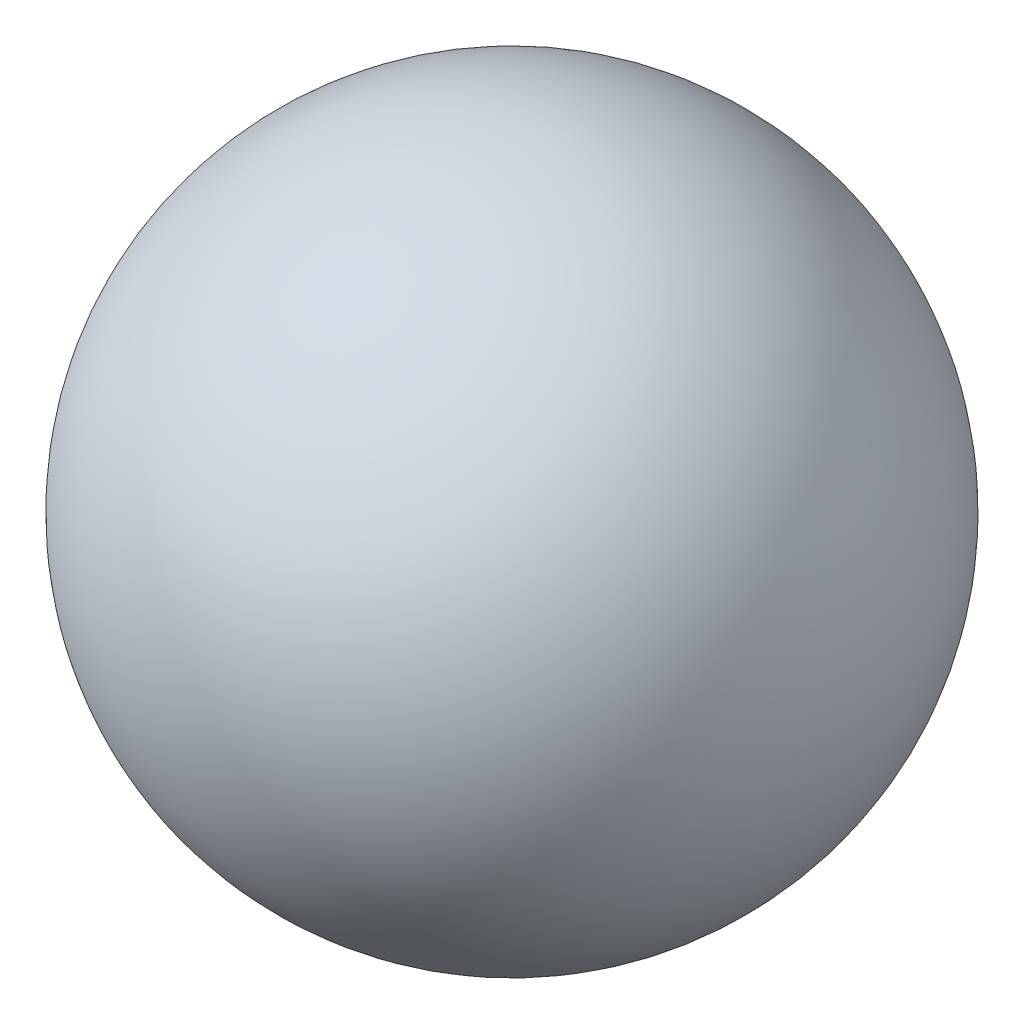
ISO-10303-21;
HEADER;
FILE_DESCRIPTION(('STEP AP214'),'2;1');
FILE_NAME('part.step','',(''),(''),'','','');
FILE_SCHEMA(('AUTOMOTIVE_DESIGN { 1 0 10303 214 1 1 1 1 }'));
ENDSEC;
DATA;
#1=APPLICATION_CONTEXT('core data for automotive mechanical design processes');
#2=APPLICATION_PROTOCOL_DEFINITION('international standard','automotive_design',2000,#1);
#3=PRODUCT_CONTEXT('',#1,'mechanical');
#4=PRODUCT('Part','Part','',(#3));
#5=PRODUCT_RELATED_PRODUCT_CATEGORY('part','',(#4));
#6=PRODUCT_DEFINITION_FORMATION('','',#4);
#7=PRODUCT_DEFINITION_CONTEXT('part definition',#1,'design');
#8=PRODUCT_DEFINITION('design','',#6,#7);
#9=PRODUCT_DEFINITION_SHAPE('','',#8);
#10=(LENGTH_UNIT() NAMED_UNIT(*) SI_UNIT(.MILLI.,.METRE.));
#11=(NAMED_UNIT(*) PLANE_ANGLE_UNIT() SI_UNIT($,.RADIAN.));
#12=(NAMED_UNIT(*) SI_UNIT($,.STERADIAN.) SOLID_ANGLE_UNIT());
#13=UNCERTAINTY_MEASURE_WITH_UNIT(LENGTH_MEASURE(1.E-05),#10,'distance_accuracy_value','');
#14=(GEOMETRIC_REPRESENTATION_CONTEXT(3) GLOBAL_UNCERTAINTY_ASSIGNED_CONTEXT((#13)) GLOBAL_UNIT_ASSIGNED_CONTEXT((#10,
#11,#12)) REPRESENTATION_CONTEXT('',''));
#15=CARTESIAN_POINT('',(0.,0.,0.));
#16=DIRECTION('',(0.,0.,1.));
#17=DIRECTION('',(1.,0.,0.));
#18=AXIS2_PLACEMENT_3D('',#15,#16,#17);
#19=CARTESIAN_POINT('',(0.,0.,0.));
#20=DIRECTION('',(0.,0.,-1.));
#21=DIRECTION('',(1.,0.,0.));
#22=AXIS2_PLACEMENT_3D('',#19,#20,#21);
#23=SPHERICAL_SURFACE('',#22,6.35);
#24=CARTESIAN_POINT('',(0.,0.,-6.35));
#25=VERTEX_POINT('',#24);
#26=VERTEX_LOOP('',#25);
#27=FACE_BOUND('',#26,.T.);
#28=ADVANCED_FACE('F39',(#27),#23,.T.);
#29=CLOSED_SHELL('',(#28));
#30=MANIFOLD_SOLID_BREP('B2',#29);
#31=ADVANCED_BREP_SHAPE_REPRESENTATION('',(#18,#30),#14);
#32=SHAPE_DEFINITION_REPRESENTATION(#9,#31);
ENDSEC;
END-ISO-10303-21;
